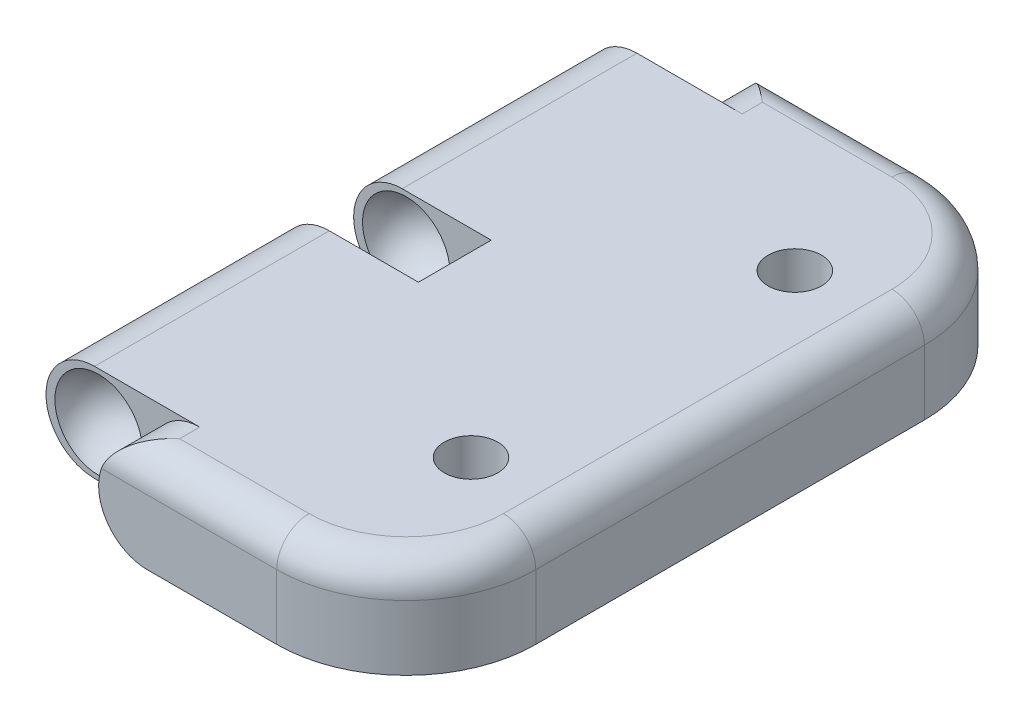
ISO-10303-21;
HEADER;
FILE_DESCRIPTION(('STEP AP214'),'2;1');
FILE_NAME('part.step','',(''),(''),'','','');
FILE_SCHEMA(('AUTOMOTIVE_DESIGN { 1 0 10303 214 1 1 1 1 }'));
ENDSEC;
DATA;
#1=APPLICATION_CONTEXT('core data for automotive mechanical design processes');
#2=APPLICATION_PROTOCOL_DEFINITION('international standard','automotive_design',2000,#1);
#3=PRODUCT_CONTEXT('',#1,'mechanical');
#4=PRODUCT('Part','Part','',(#3));
#5=PRODUCT_RELATED_PRODUCT_CATEGORY('part','',(#4));
#6=PRODUCT_DEFINITION_FORMATION('','',#4);
#7=PRODUCT_DEFINITION_CONTEXT('part definition',#1,'design');
#8=PRODUCT_DEFINITION('design','',#6,#7);
#9=PRODUCT_DEFINITION_SHAPE('','',#8);
#10=(LENGTH_UNIT() NAMED_UNIT(*) SI_UNIT(.MILLI.,.METRE.));
#11=(NAMED_UNIT(*) PLANE_ANGLE_UNIT() SI_UNIT($,.RADIAN.));
#12=(NAMED_UNIT(*) SI_UNIT($,.STERADIAN.) SOLID_ANGLE_UNIT());
#13=UNCERTAINTY_MEASURE_WITH_UNIT(LENGTH_MEASURE(1.E-05),#10,'distance_accuracy_value','');
#14=(GEOMETRIC_REPRESENTATION_CONTEXT(3) GLOBAL_UNCERTAINTY_ASSIGNED_CONTEXT((#13)) GLOBAL_UNIT_ASSIGNED_CONTEXT((#10,
#11,#12)) REPRESENTATION_CONTEXT('',''));
#15=CARTESIAN_POINT('',(0.,0.,0.));
#16=DIRECTION('',(0.,0.,1.));
#17=DIRECTION('',(1.,0.,0.));
#18=AXIS2_PLACEMENT_3D('',#15,#16,#17);
#19=CARTESIAN_POINT('',(652.958258550736,837.706805087975,1246.54216775539));
#20=DIRECTION('',(-1.,0.,0.));
#21=DIRECTION('',(0.,0.,1.));
#22=AXIS2_PLACEMENT_3D('',#19,#20,#21);
#23=PLANE('',#22);
#24=DIRECTION('',(0.,1.,0.));
#25=VECTOR('',#24,1.);
#26=CARTESIAN_POINT('',(652.958258550736,837.706805087975,1268.79216775539));
#27=LINE('',#26,#25);
#28=CARTESIAN_POINT('',(652.958258550736,881.989984738944,1268.79216775539));
#29=VERTEX_POINT('',#28);
#30=CARTESIAN_POINT('',(652.958258550736,884.989984738944,1268.79216775539));
#31=VERTEX_POINT('',#30);
#32=EDGE_CURVE('E291',#29,#31,#27,.T.);
#33=ORIENTED_EDGE('',*,*,#32,.T.);
#34=DIRECTION('',(0.,0.,-1.));
#35=VECTOR('',#34,1.);
#36=CARTESIAN_POINT('',(652.958258550736,884.989984738944,1246.54216775539));
#37=LINE('',#36,#35);
#38=CARTESIAN_POINT('',(652.958258550736,884.989984738944,1264.29216775539));
#39=VERTEX_POINT('',#38);
#40=EDGE_CURVE('E65',#31,#39,#37,.T.);
#41=ORIENTED_EDGE('',*,*,#40,.T.);
#42=DIRECTION('',(0.,1.,0.));
#43=VECTOR('',#42,1.);
#44=CARTESIAN_POINT('',(652.958258550736,887.989984738944,1264.29216775539));
#45=LINE('',#44,#43);
#46=CARTESIAN_POINT('',(652.958258550736,881.989984738944,1264.29216775539));
#47=VERTEX_POINT('',#46);
#48=EDGE_CURVE('E243',#47,#39,#45,.T.);
#49=ORIENTED_EDGE('',*,*,#48,.F.);
#50=DIRECTION('',(0.,0.,-1.));
#51=VECTOR('',#50,1.);
#52=CARTESIAN_POINT('',(652.958258550736,881.989984738944,1246.54216775539));
#53=LINE('',#52,#51);
#54=EDGE_CURVE('E250',#29,#47,#53,.T.);
#55=ORIENTED_EDGE('',*,*,#54,.F.);
#56=EDGE_LOOP('',(#33,#41,#49,#55));
#57=FACE_BOUND('',#56,.T.);
#58=ADVANCED_FACE('F50',(#57),#23,.T.);
#59=CARTESIAN_POINT('',(659.458258550736,887.989984738944,1264.29216775539));
#60=DIRECTION('',(0.,0.,-1.));
#61=DIRECTION('',(-1.,0.,0.));
#62=AXIS2_PLACEMENT_3D('',#59,#60,#61);
#63=PLANE('',#62);
#64=CARTESIAN_POINT('',(649.708258550736,884.989984738944,1264.29216775539));
#65=DIRECTION('',(0.,0.,-1.));
#66=DIRECTION('',(-1.,0.,0.));
#67=AXIS2_PLACEMENT_3D('',#64,#65,#66);
#68=CIRCLE('',#67,2.70000000000001);
#69=CARTESIAN_POINT('',(647.008258550736,884.989984738944,1264.29216775539));
#70=VERTEX_POINT('',#69);
#71=EDGE_CURVE('E267',#70,#70,#68,.T.);
#72=ORIENTED_EDGE('',*,*,#71,.T.);
#73=EDGE_LOOP('',(#72));
#74=FACE_BOUND('',#73,.T.);
#75=DIRECTION('',(1.,0.,0.));
#76=VECTOR('',#75,1.);
#77=CARTESIAN_POINT('',(659.458258550736,881.989984738944,1264.29216775539));
#78=LINE('',#77,#76);
#79=CARTESIAN_POINT('',(649.458258550736,881.989984738944,1264.29216775539));
#80=VERTEX_POINT('',#79);
#81=EDGE_CURVE('E279',#80,#47,#78,.T.);
#82=ORIENTED_EDGE('',*,*,#81,.T.);
#83=ORIENTED_EDGE('',*,*,#48,.T.);
#84=DIRECTION('',(-0.554700196225229,-0.832050294337844,0.));
#85=VECTOR('',#84,1.);
#86=CARTESIAN_POINT('',(656.342873935351,890.066907815867,1264.29216775539));
#87=LINE('',#86,#85);
#88=CARTESIAN_POINT('',(654.958258550736,887.989984738944,1264.29216775539));
#89=VERTEX_POINT('',#88);
#90=EDGE_CURVE('E11',#39,#89,#87,.F.);
#91=ORIENTED_EDGE('',*,*,#90,.T.);
#92=DIRECTION('',(1.,0.,0.));
#93=VECTOR('',#92,1.);
#94=CARTESIAN_POINT('',(659.458258550736,887.989984738944,1264.29216775539));
#95=LINE('',#94,#93);
#96=CARTESIAN_POINT('',(649.458258550736,887.989984738944,1264.29216775539));
#97=VERTEX_POINT('',#96);
#98=EDGE_CURVE('E268',#97,#89,#95,.T.);
#99=ORIENTED_EDGE('',*,*,#98,.F.);
#100=CARTESIAN_POINT('',(649.458258550736,884.989984738944,1264.29216775539));
#101=DIRECTION('',(0.,0.,-1.));
#102=DIRECTION('',(-1.,0.,0.));
#103=AXIS2_PLACEMENT_3D('',#100,#101,#102);
#104=CIRCLE('',#103,3.);
#105=CARTESIAN_POINT('',(646.458258550736,884.989984738944,1264.29216775539));
#106=VERTEX_POINT('',#105);
#107=EDGE_CURVE('E287',#97,#106,#104,.F.);
#108=ORIENTED_EDGE('',*,*,#107,.T.);
#109=CARTESIAN_POINT('',(649.458258550736,884.989984738944,1264.29216775539));
#110=DIRECTION('',(0.,0.,-1.));
#111=DIRECTION('',(-1.,0.,0.));
#112=AXIS2_PLACEMENT_3D('',#109,#110,#111);
#113=CIRCLE('',#112,3.);
#114=EDGE_CURVE('E289',#106,#80,#113,.F.);
#115=ORIENTED_EDGE('',*,*,#114,.T.);
#116=EDGE_LOOP('',(#82,#83,#91,#99,#108,#115));
#117=FACE_BOUND('',#116,.T.);
#118=ADVANCED_FACE('F425',(#74,#117),#63,.F.);
#119=CARTESIAN_POINT('',(659.458258550736,887.989984738944,1249.79216775539));
#120=DIRECTION('',(0.,0.,1.));
#121=DIRECTION('',(1.,0.,0.));
#122=AXIS2_PLACEMENT_3D('',#119,#120,#121);
#123=PLANE('',#122);
#124=CARTESIAN_POINT('',(649.708258550736,884.989984738944,1249.79216775539));
#125=DIRECTION('',(0.,0.,-1.));
#126=DIRECTION('',(-1.,0.,0.));
#127=AXIS2_PLACEMENT_3D('',#124,#125,#126);
#128=CIRCLE('',#127,2.70000000000001);
#129=CARTESIAN_POINT('',(647.008258550736,884.989984738944,1249.79216775539));
#130=VERTEX_POINT('',#129);
#131=EDGE_CURVE('E261',#130,#130,#128,.T.);
#132=ORIENTED_EDGE('',*,*,#131,.F.);
#133=EDGE_LOOP('',(#132));
#134=FACE_BOUND('',#133,.T.);
#135=DIRECTION('',(-1.,0.,0.));
#136=VECTOR('',#135,1.);
#137=CARTESIAN_POINT('',(659.458258550736,887.989984738944,1249.79216775539));
#138=LINE('',#137,#136);
#139=CARTESIAN_POINT('',(655.958258550736,887.989984738944,1249.79216775539));
#140=VERTEX_POINT('',#139);
#141=CARTESIAN_POINT('',(649.458258550736,887.989984738944,1249.79216775539));
#142=VERTEX_POINT('',#141);
#143=EDGE_CURVE('E275',#140,#142,#138,.T.);
#144=ORIENTED_EDGE('',*,*,#143,.F.);
#145=CARTESIAN_POINT('',(655.958258550736,884.989984738944,1249.79216775539));
#146=DIRECTION('',(0.,0.,1.));
#147=DIRECTION('',(1.,0.,0.));
#148=AXIS2_PLACEMENT_3D('',#145,#146,#147);
#149=CIRCLE('',#148,3.);
#150=CARTESIAN_POINT('',(652.958258550736,884.989984738944,1249.79216775539));
#151=VERTEX_POINT('',#150);
#152=EDGE_CURVE('E318',#140,#151,#149,.T.);
#153=ORIENTED_EDGE('',*,*,#152,.T.);
#154=CARTESIAN_POINT('',(655.958258550736,884.989984738944,1249.79216775539));
#155=DIRECTION('',(0.,0.,1.));
#156=DIRECTION('',(1.,0.,0.));
#157=AXIS2_PLACEMENT_3D('',#154,#155,#156);
#158=CIRCLE('',#157,3.);
#159=CARTESIAN_POINT('',(655.958258550736,881.989984738944,1249.79216775539));
#160=VERTEX_POINT('',#159);
#161=EDGE_CURVE('E320',#151,#160,#158,.T.);
#162=ORIENTED_EDGE('',*,*,#161,.T.);
#163=DIRECTION('',(-1.,0.,0.));
#164=VECTOR('',#163,1.);
#165=CARTESIAN_POINT('',(659.458258550736,881.989984738944,1249.79216775539));
#166=LINE('',#165,#164);
#167=CARTESIAN_POINT('',(649.458258550736,881.989984738944,1249.79216775539));
#168=VERTEX_POINT('',#167);
#169=EDGE_CURVE('E271',#160,#168,#166,.T.);
#170=ORIENTED_EDGE('',*,*,#169,.T.);
#171=CARTESIAN_POINT('',(649.458258550736,884.989984738944,1249.79216775539));
#172=DIRECTION('',(0.,0.,1.));
#173=DIRECTION('',(1.,0.,0.));
#174=AXIS2_PLACEMENT_3D('',#171,#172,#173);
#175=CIRCLE('',#174,3.);
#176=CARTESIAN_POINT('',(646.458258550736,884.989984738944,1249.79216775539));
#177=VERTEX_POINT('',#176);
#178=EDGE_CURVE('E282',#168,#177,#175,.F.);
#179=ORIENTED_EDGE('',*,*,#178,.T.);
#180=CARTESIAN_POINT('',(649.458258550736,884.989984738944,1249.79216775539));
#181=DIRECTION('',(0.,0.,1.));
#182=DIRECTION('',(1.,0.,0.));
#183=AXIS2_PLACEMENT_3D('',#180,#181,#182);
#184=CIRCLE('',#183,3.);
#185=EDGE_CURVE('E283',#177,#142,#184,.F.);
#186=ORIENTED_EDGE('',*,*,#185,.T.);
#187=EDGE_LOOP('',(#144,#153,#162,#170,#179,#186));
#188=FACE_BOUND('',#187,.T.);
#189=ADVANCED_FACE('F429',(#134,#188),#123,.F.);
#190=CARTESIAN_POINT('',(652.958258550736,887.989984738944,1257.04216775539));
#191=DIRECTION('',(0.,1.,0.));
#192=DIRECTION('',(0.,0.,1.));
#193=AXIS2_PLACEMENT_3D('',#190,#191,#192);
#194=PLANE('',#193);
#195=DIRECTION('',(0.,0.,1.));
#196=VECTOR('',#195,1.);
#197=CARTESIAN_POINT('',(654.958258550736,887.989984738944,1257.04216775539));
#198=LINE('',#197,#196);
#199=CARTESIAN_POINT('',(654.958258550736,887.989984738944,1268.79216775539));
#200=VERTEX_POINT('',#199);
#201=EDGE_CURVE('E474',#89,#200,#198,.T.);
#202=ORIENTED_EDGE('',*,*,#201,.T.);
#203=DIRECTION('',(-1.,0.,0.));
#204=VECTOR('',#203,1.);
#205=CARTESIAN_POINT('',(659.458258550736,887.989984738944,1268.79216775539));
#206=LINE('',#205,#204);
#207=CARTESIAN_POINT('',(649.458258550736,887.989984738944,1268.79216775539));
#208=VERTEX_POINT('',#207);
#209=EDGE_CURVE('E203',#200,#208,#206,.T.);
#210=ORIENTED_EDGE('',*,*,#209,.T.);
#211=DIRECTION('',(0.,0.,1.));
#212=VECTOR('',#211,1.);
#213=CARTESIAN_POINT('',(649.458258550736,887.989984738944,1283.29216775539));
#214=LINE('',#213,#212);
#215=CARTESIAN_POINT('',(649.458258550736,887.989984738944,1283.29216775539));
#216=VERTEX_POINT('',#215);
#217=EDGE_CURVE('E200',#208,#216,#214,.T.);
#218=ORIENTED_EDGE('',*,*,#217,.T.);
#219=DIRECTION('',(1.,0.,0.));
#220=VECTOR('',#219,1.);
#221=CARTESIAN_POINT('',(659.458258550736,887.989984738944,1283.29216775539));
#222=LINE('',#221,#220);
#223=CARTESIAN_POINT('',(655.958258550736,887.989984738944,1283.29216775539));
#224=VERTEX_POINT('',#223);
#225=EDGE_CURVE('E204',#216,#224,#222,.T.);
#226=ORIENTED_EDGE('',*,*,#225,.T.);
#227=DIRECTION('',(0.,0.,1.));
#228=VECTOR('',#227,1.);
#229=CARTESIAN_POINT('',(655.958258550736,887.989984738944,1257.04216775539));
#230=LINE('',#229,#228);
#231=CARTESIAN_POINT('',(655.958258550736,887.989984738944,1284.54216775539));
#232=VERTEX_POINT('',#231);
#233=EDGE_CURVE('E308',#224,#232,#230,.T.);
#234=ORIENTED_EDGE('',*,*,#233,.T.);
#235=DIRECTION('',(1.,0.,0.));
#236=VECTOR('',#235,1.);
#237=CARTESIAN_POINT('',(652.958258550736,887.989984738944,1284.54216775539));
#238=LINE('',#237,#236);
#239=CARTESIAN_POINT('',(663.958258550736,887.989984738944,1284.54216775539));
#240=VERTEX_POINT('',#239);
#241=EDGE_CURVE('E352',#232,#240,#238,.T.);
#242=ORIENTED_EDGE('',*,*,#241,.T.);
#243=CARTESIAN_POINT('',(663.958258550736,887.989984738944,1278.54216775539));
#244=DIRECTION('',(0.,1.,0.));
#245=DIRECTION('',(0.,0.,1.));
#246=AXIS2_PLACEMENT_3D('',#243,#244,#245);
#247=CIRCLE('',#246,6.);
#248=CARTESIAN_POINT('',(669.958258550736,887.989984738944,1278.54216775539));
#249=VERTEX_POINT('',#248);
#250=EDGE_CURVE('E347',#240,#249,#247,.T.);
#251=ORIENTED_EDGE('',*,*,#250,.T.);
#252=DIRECTION('',(0.,0.,-1.));
#253=VECTOR('',#252,1.);
#254=CARTESIAN_POINT('',(669.958258550736,887.989984738944,1257.04216775539));
#255=LINE('',#254,#253);
#256=CARTESIAN_POINT('',(669.958258550736,887.989984738944,1254.54216775539));
#257=VERTEX_POINT('',#256);
#258=EDGE_CURVE('E350',#249,#257,#255,.T.);
#259=ORIENTED_EDGE('',*,*,#258,.T.);
#260=CARTESIAN_POINT('',(663.958258550736,887.989984738944,1254.54216775539));
#261=DIRECTION('',(0.,1.,0.));
#262=DIRECTION('',(0.,0.,1.));
#263=AXIS2_PLACEMENT_3D('',#260,#261,#262);
#264=CIRCLE('',#263,6.);
#265=CARTESIAN_POINT('',(663.958258550736,887.989984738944,1248.54216775539));
#266=VERTEX_POINT('',#265);
#267=EDGE_CURVE('E354',#257,#266,#264,.T.);
#268=ORIENTED_EDGE('',*,*,#267,.T.);
#269=DIRECTION('',(-1.,0.,0.));
#270=VECTOR('',#269,1.);
#271=CARTESIAN_POINT('',(652.958258550736,887.989984738944,1248.54216775539));
#272=LINE('',#271,#270);
#273=CARTESIAN_POINT('',(655.958258550736,887.989984738944,1248.54216775539));
#274=VERTEX_POINT('',#273);
#275=EDGE_CURVE('E353',#266,#274,#272,.T.);
#276=ORIENTED_EDGE('',*,*,#275,.T.);
#277=DIRECTION('',(0.,0.,1.));
#278=VECTOR('',#277,1.);
#279=CARTESIAN_POINT('',(655.958258550736,887.989984738944,1257.04216775539));
#280=LINE('',#279,#278);
#281=EDGE_CURVE('E309',#274,#140,#280,.T.);
#282=ORIENTED_EDGE('',*,*,#281,.T.);
#283=ORIENTED_EDGE('',*,*,#143,.T.);
#284=DIRECTION('',(0.,0.,1.));
#285=VECTOR('',#284,1.);
#286=CARTESIAN_POINT('',(649.458258550736,887.989984738944,1264.29216775539));
#287=LINE('',#286,#285);
#288=EDGE_CURVE('E273',#142,#97,#287,.T.);
#289=ORIENTED_EDGE('',*,*,#288,.T.);
#290=ORIENTED_EDGE('',*,*,#98,.T.);
#291=EDGE_LOOP('',(#202,#210,#218,#226,#234,#242,#251,#259,#268,#276,#282,#283,#289,#290));
#292=FACE_BOUND('',#291,.T.);
#293=CARTESIAN_POINT('',(665.958258550736,887.989984738944,1256.54216775539));
#294=DIRECTION('',(0.,1.,0.));
#295=DIRECTION('',(0.,0.,1.));
#296=AXIS2_PLACEMENT_3D('',#293,#294,#295);
#297=CIRCLE('',#296,1.65000000000005);
#298=CARTESIAN_POINT('',(665.958258550736,887.989984738944,1258.19216775539));
#299=VERTEX_POINT('',#298);
#300=EDGE_CURVE('E255',#299,#299,#297,.T.);
#301=ORIENTED_EDGE('',*,*,#300,.F.);
#302=EDGE_LOOP('',(#301));
#303=FACE_BOUND('',#302,.T.);
#304=CARTESIAN_POINT('',(665.958258550736,887.989984738944,1276.54216775539));
#305=DIRECTION('',(0.,1.,0.));
#306=DIRECTION('',(0.,0.,1.));
#307=AXIS2_PLACEMENT_3D('',#304,#305,#306);
#308=CIRCLE('',#307,1.65000000000005);
#309=CARTESIAN_POINT('',(665.958258550736,887.989984738944,1278.19216775539));
#310=VERTEX_POINT('',#309);
#311=EDGE_CURVE('E236',#310,#310,#308,.T.);
#312=ORIENTED_EDGE('',*,*,#311,.F.);
#313=EDGE_LOOP('',(#312));
#314=FACE_BOUND('',#313,.T.);
#315=ADVANCED_FACE('F199',(#292,#303,#314),#194,.T.);
#316=CARTESIAN_POINT('',(652.958258550736,881.989984738944,1257.04216775539));
#317=DIRECTION('',(0.,1.,0.));
#318=DIRECTION('',(0.,0.,1.));
#319=AXIS2_PLACEMENT_3D('',#316,#317,#318);
#320=PLANE('',#319);
#321=DIRECTION('',(0.,0.,1.));
#322=VECTOR('',#321,1.);
#323=CARTESIAN_POINT('',(671.958258550736,881.989984738944,1246.54216775539));
#324=LINE('',#323,#322);
#325=CARTESIAN_POINT('',(671.958258550736,881.989984738944,1254.54216775539));
#326=VERTEX_POINT('',#325);
#327=CARTESIAN_POINT('',(671.958258550736,881.989984738944,1278.54216775539));
#328=VERTEX_POINT('',#327);
#329=EDGE_CURVE('E247',#326,#328,#324,.T.);
#330=ORIENTED_EDGE('',*,*,#329,.T.);
#331=CARTESIAN_POINT('',(663.958258550736,881.989984738944,1278.54216775539));
#332=DIRECTION('',(0.,1.,0.));
#333=DIRECTION('',(0.,0.,1.));
#334=AXIS2_PLACEMENT_3D('',#331,#332,#333);
#335=CIRCLE('',#334,8.);
#336=CARTESIAN_POINT('',(663.958258550736,881.989984738944,1286.54216775539));
#337=VERTEX_POINT('',#336);
#338=EDGE_CURVE('E345',#328,#337,#335,.F.);
#339=ORIENTED_EDGE('',*,*,#338,.T.);
#340=DIRECTION('',(-1.,0.,0.));
#341=VECTOR('',#340,1.);
#342=CARTESIAN_POINT('',(652.958258550736,881.989984738944,1286.54216775539));
#343=LINE('',#342,#341);
#344=CARTESIAN_POINT('',(655.958258550736,881.989984738944,1286.54216775539));
#345=VERTEX_POINT('',#344);
#346=EDGE_CURVE('E244',#337,#345,#343,.T.);
#347=ORIENTED_EDGE('',*,*,#346,.T.);
#348=DIRECTION('',(0.,0.,-1.));
#349=VECTOR('',#348,1.);
#350=CARTESIAN_POINT('',(655.958258550736,881.989984738944,1283.29216775539));
#351=LINE('',#350,#349);
#352=CARTESIAN_POINT('',(655.958258550736,881.989984738944,1283.29216775539));
#353=VERTEX_POINT('',#352);
#354=EDGE_CURVE('E300',#345,#353,#351,.T.);
#355=ORIENTED_EDGE('',*,*,#354,.T.);
#356=DIRECTION('',(1.,0.,0.));
#357=VECTOR('',#356,1.);
#358=CARTESIAN_POINT('',(659.458258550736,881.989984738944,1283.29216775539));
#359=LINE('',#358,#357);
#360=CARTESIAN_POINT('',(649.458258550736,881.989984738944,1283.29216775539));
#361=VERTEX_POINT('',#360);
#362=EDGE_CURVE('E238',#361,#353,#359,.T.);
#363=ORIENTED_EDGE('',*,*,#362,.F.);
#364=DIRECTION('',(0.,0.,1.));
#365=VECTOR('',#364,1.);
#366=CARTESIAN_POINT('',(649.458258550736,881.989984738944,1276.04216775539));
#367=LINE('',#366,#365);
#368=CARTESIAN_POINT('',(649.458258550736,881.989984738944,1268.79216775539));
#369=VERTEX_POINT('',#368);
#370=EDGE_CURVE('E230',#361,#369,#367,.F.);
#371=ORIENTED_EDGE('',*,*,#370,.T.);
#372=DIRECTION('',(-1.,0.,0.));
#373=VECTOR('',#372,1.);
#374=CARTESIAN_POINT('',(659.458258550736,881.989984738944,1268.79216775539));
#375=LINE('',#374,#373);
#376=EDGE_CURVE('E219',#29,#369,#375,.T.);
#377=ORIENTED_EDGE('',*,*,#376,.F.);
#378=ORIENTED_EDGE('',*,*,#54,.T.);
#379=ORIENTED_EDGE('',*,*,#81,.F.);
#380=DIRECTION('',(0.,0.,1.));
#381=VECTOR('',#380,1.);
#382=CARTESIAN_POINT('',(649.458258550736,881.989984738944,1257.04216775539));
#383=LINE('',#382,#381);
#384=EDGE_CURVE('E288',#80,#168,#383,.F.);
#385=ORIENTED_EDGE('',*,*,#384,.T.);
#386=ORIENTED_EDGE('',*,*,#169,.F.);
#387=DIRECTION('',(0.,0.,-1.));
#388=VECTOR('',#387,1.);
#389=CARTESIAN_POINT('',(655.958258550736,881.989984738944,1246.54216775539));
#390=LINE('',#389,#388);
#391=CARTESIAN_POINT('',(655.958258550736,881.989984738944,1246.54216775539));
#392=VERTEX_POINT('',#391);
#393=EDGE_CURVE('E297',#160,#392,#390,.T.);
#394=ORIENTED_EDGE('',*,*,#393,.T.);
#395=DIRECTION('',(1.,0.,0.));
#396=VECTOR('',#395,1.);
#397=CARTESIAN_POINT('',(652.958258550736,881.989984738944,1246.54216775539));
#398=LINE('',#397,#396);
#399=CARTESIAN_POINT('',(663.958258550736,881.989984738944,1246.54216775539));
#400=VERTEX_POINT('',#399);
#401=EDGE_CURVE('E252',#392,#400,#398,.T.);
#402=ORIENTED_EDGE('',*,*,#401,.T.);
#403=CARTESIAN_POINT('',(663.958258550736,881.989984738944,1254.54216775539));
#404=DIRECTION('',(0.,1.,0.));
#405=DIRECTION('',(0.,0.,1.));
#406=AXIS2_PLACEMENT_3D('',#403,#404,#405);
#407=CIRCLE('',#406,8.);
#408=EDGE_CURVE('E344',#400,#326,#407,.F.);
#409=ORIENTED_EDGE('',*,*,#408,.T.);
#410=EDGE_LOOP('',(#330,#339,#347,#355,#363,#371,#377,#378,#379,#385,#386,#394,#402,#409));
#411=FACE_BOUND('',#410,.T.);
#412=CARTESIAN_POINT('',(665.958258550736,881.989984738944,1256.54216775539));
#413=DIRECTION('',(0.,1.,0.));
#414=DIRECTION('',(0.,0.,1.));
#415=AXIS2_PLACEMENT_3D('',#412,#413,#414);
#416=CIRCLE('',#415,1.65000000000005);
#417=CARTESIAN_POINT('',(665.958258550736,881.989984738944,1258.19216775539));
#418=VERTEX_POINT('',#417);
#419=EDGE_CURVE('E239',#418,#418,#416,.F.);
#420=ORIENTED_EDGE('',*,*,#419,.F.);
#421=EDGE_LOOP('',(#420));
#422=FACE_BOUND('',#421,.T.);
#423=CARTESIAN_POINT('',(665.958258550736,881.989984738944,1276.54216775539));
#424=DIRECTION('',(0.,1.,0.));
#425=DIRECTION('',(0.,0.,1.));
#426=AXIS2_PLACEMENT_3D('',#423,#424,#425);
#427=CIRCLE('',#426,1.65000000000005);
#428=CARTESIAN_POINT('',(665.958258550736,881.989984738944,1278.19216775539));
#429=VERTEX_POINT('',#428);
#430=EDGE_CURVE('E242',#429,#429,#427,.F.);
#431=ORIENTED_EDGE('',*,*,#430,.F.);
#432=EDGE_LOOP('',(#431));
#433=FACE_BOUND('',#432,.T.);
#434=ADVANCED_FACE('F450',(#411,#422,#433),#320,.F.);
#435=CARTESIAN_POINT('',(649.458258550736,884.989984738944,1257.04216775539));
#436=DIRECTION('',(0.,0.,-1.));
#437=DIRECTION('',(-1.,0.,0.));
#438=AXIS2_PLACEMENT_3D('',#435,#436,#437);
#439=CYLINDRICAL_SURFACE('',#438,3.);
#440=ORIENTED_EDGE('',*,*,#288,.F.);
#441=ORIENTED_EDGE('',*,*,#185,.F.);
#442=DIRECTION('',(0.,0.,1.));
#443=VECTOR('',#442,1.);
#444=CARTESIAN_POINT('',(646.458258550736,884.989984738944,1249.79216775539));
#445=LINE('',#444,#443);
#446=EDGE_CURVE('E266',#106,#177,#445,.F.);
#447=ORIENTED_EDGE('',*,*,#446,.F.);
#448=ORIENTED_EDGE('',*,*,#107,.F.);
#449=EDGE_LOOP('',(#440,#441,#447,#448));
#450=FACE_BOUND('',#449,.T.);
#451=ADVANCED_FACE('F448',(#450),#439,.T.);
#452=CARTESIAN_POINT('',(649.458258550736,884.989984738944,1264.29216775539));
#453=DIRECTION('',(0.,0.,1.));
#454=DIRECTION('',(1.,0.,0.));
#455=AXIS2_PLACEMENT_3D('',#452,#453,#454);
#456=CYLINDRICAL_SURFACE('',#455,3.);
#457=ORIENTED_EDGE('',*,*,#178,.F.);
#458=ORIENTED_EDGE('',*,*,#384,.F.);
#459=ORIENTED_EDGE('',*,*,#114,.F.);
#460=ORIENTED_EDGE('',*,*,#446,.T.);
#461=EDGE_LOOP('',(#457,#458,#459,#460));
#462=FACE_BOUND('',#461,.T.);
#463=ADVANCED_FACE('F442',(#462),#456,.T.);
#464=CARTESIAN_POINT('',(649.708258550736,884.989984738944,1264.29216775539));
#465=DIRECTION('',(0.,0.,1.));
#466=DIRECTION('',(0.,-1.,0.));
#467=AXIS2_PLACEMENT_3D('',#464,#465,#466);
#468=SPHERICAL_SURFACE('',#467,2.7);
#469=ORIENTED_EDGE('',*,*,#71,.F.);
#470=EDGE_LOOP('',(#469));
#471=FACE_BOUND('',#470,.T.);
#472=ADVANCED_FACE('F437',(#471),#468,.F.);
#473=CARTESIAN_POINT('',(649.708258550736,884.989984738944,1249.79216775539));
#474=DIRECTION('',(0.,0.,-1.));
#475=DIRECTION('',(0.,-1.,0.));
#476=AXIS2_PLACEMENT_3D('',#473,#474,#475);
#477=SPHERICAL_SURFACE('',#476,2.7);
#478=ORIENTED_EDGE('',*,*,#131,.T.);
#479=EDGE_LOOP('',(#478));
#480=FACE_BOUND('',#479,.T.);
#481=ADVANCED_FACE('F436',(#480),#477,.F.);
#482=CARTESIAN_POINT('',(652.958258550736,837.706805087975,1286.54216775539));
#483=DIRECTION('',(0.,0.,1.));
#484=DIRECTION('',(1.,0.,0.));
#485=AXIS2_PLACEMENT_3D('',#482,#483,#484);
#486=PLANE('',#485);
#487=DIRECTION('',(0.,1.,0.));
#488=VECTOR('',#487,1.);
#489=CARTESIAN_POINT('',(663.958258550736,837.706805087975,1286.54216775539));
#490=LINE('',#489,#488);
#491=CARTESIAN_POINT('',(663.958258550736,885.989984738944,1286.54216775539));
#492=VERTEX_POINT('',#491);
#493=EDGE_CURVE('E322',#337,#492,#490,.T.);
#494=ORIENTED_EDGE('',*,*,#493,.T.);
#495=DIRECTION('',(1.,0.,0.));
#496=VECTOR('',#495,1.);
#497=CARTESIAN_POINT('',(652.958258550736,885.989984738944,1286.54216775539));
#498=LINE('',#497,#496);
#499=CARTESIAN_POINT('',(653.12983142599,885.989984738944,1286.54216775539));
#500=VERTEX_POINT('',#499);
#501=EDGE_CURVE('E398',#492,#500,#498,.F.);
#502=ORIENTED_EDGE('',*,*,#501,.T.);
#503=CARTESIAN_POINT('',(655.958258550736,884.989984738944,1286.54216775539));
#504=DIRECTION('',(0.,0.,1.));
#505=DIRECTION('',(1.,0.,0.));
#506=AXIS2_PLACEMENT_3D('',#503,#504,#505);
#507=CIRCLE('',#506,3.);
#508=CARTESIAN_POINT('',(652.958258550736,884.989984738944,1286.54216775539));
#509=VERTEX_POINT('',#508);
#510=EDGE_CURVE('E315',#500,#509,#507,.T.);
#511=ORIENTED_EDGE('',*,*,#510,.T.);
#512=CARTESIAN_POINT('',(655.958258550736,884.989984738944,1286.54216775539));
#513=DIRECTION('',(0.,0.,1.));
#514=DIRECTION('',(1.,0.,0.));
#515=AXIS2_PLACEMENT_3D('',#512,#513,#514);
#516=CIRCLE('',#515,3.);
#517=EDGE_CURVE('E313',#509,#345,#516,.T.);
#518=ORIENTED_EDGE('',*,*,#517,.T.);
#519=ORIENTED_EDGE('',*,*,#346,.F.);
#520=EDGE_LOOP('',(#494,#502,#511,#518,#519));
#521=FACE_BOUND('',#520,.T.);
#522=ADVANCED_FACE('F432',(#521),#486,.T.);
#523=CARTESIAN_POINT('',(671.958258550736,837.706805087975,1246.54216775539));
#524=DIRECTION('',(1.,0.,0.));
#525=DIRECTION('',(0.,0.,-1.));
#526=AXIS2_PLACEMENT_3D('',#523,#524,#525);
#527=PLANE('',#526);
#528=DIRECTION('',(0.,1.,0.));
#529=VECTOR('',#528,1.);
#530=CARTESIAN_POINT('',(671.958258550736,837.706805087975,1254.54216775539));
#531=LINE('',#530,#529);
#532=CARTESIAN_POINT('',(671.958258550736,885.989984738944,1254.54216775539));
#533=VERTEX_POINT('',#532);
#534=EDGE_CURVE('E337',#326,#533,#531,.T.);
#535=ORIENTED_EDGE('',*,*,#534,.T.);
#536=DIRECTION('',(0.,0.,-1.));
#537=VECTOR('',#536,1.);
#538=CARTESIAN_POINT('',(671.958258550736,885.989984738944,1246.54216775539));
#539=LINE('',#538,#537);
#540=CARTESIAN_POINT('',(671.958258550736,885.989984738944,1278.54216775539));
#541=VERTEX_POINT('',#540);
#542=EDGE_CURVE('E471',#533,#541,#539,.F.);
#543=ORIENTED_EDGE('',*,*,#542,.T.);
#544=DIRECTION('',(0.,1.,0.));
#545=VECTOR('',#544,1.);
#546=CARTESIAN_POINT('',(671.958258550736,837.706805087975,1278.54216775539));
#547=LINE('',#546,#545);
#548=EDGE_CURVE('E339',#541,#328,#547,.F.);
#549=ORIENTED_EDGE('',*,*,#548,.T.);
#550=ORIENTED_EDGE('',*,*,#329,.F.);
#551=EDGE_LOOP('',(#535,#543,#549,#550));
#552=FACE_BOUND('',#551,.T.);
#553=ADVANCED_FACE('F502',(#552),#527,.T.);
#554=CARTESIAN_POINT('',(652.958258550736,837.706805087975,1246.54216775539));
#555=DIRECTION('',(0.,0.,-1.));
#556=DIRECTION('',(-1.,0.,0.));
#557=AXIS2_PLACEMENT_3D('',#554,#555,#556);
#558=PLANE('',#557);
#559=CARTESIAN_POINT('',(655.958258550736,884.989984738944,1246.54216775539));
#560=DIRECTION('',(0.,0.,-1.));
#561=DIRECTION('',(-1.,0.,0.));
#562=AXIS2_PLACEMENT_3D('',#559,#560,#561);
#563=CIRCLE('',#562,3.);
#564=CARTESIAN_POINT('',(652.958258550736,884.989984738944,1246.54216775539));
#565=VERTEX_POINT('',#564);
#566=CARTESIAN_POINT('',(653.12983142599,885.989984738944,1246.54216775539));
#567=VERTEX_POINT('',#566);
#568=EDGE_CURVE('E303',#565,#567,#563,.T.);
#569=ORIENTED_EDGE('',*,*,#568,.T.);
#570=DIRECTION('',(-1.,0.,0.));
#571=VECTOR('',#570,1.);
#572=CARTESIAN_POINT('',(652.958258550736,885.989984738944,1246.54216775539));
#573=LINE('',#572,#571);
#574=CARTESIAN_POINT('',(663.958258550736,885.989984738944,1246.54216775539));
#575=VERTEX_POINT('',#574);
#576=EDGE_CURVE('E366',#567,#575,#573,.F.);
#577=ORIENTED_EDGE('',*,*,#576,.T.);
#578=DIRECTION('',(0.,1.,0.));
#579=VECTOR('',#578,1.);
#580=CARTESIAN_POINT('',(663.958258550736,837.706805087975,1246.54216775539));
#581=LINE('',#580,#579);
#582=EDGE_CURVE('E342',#575,#400,#581,.F.);
#583=ORIENTED_EDGE('',*,*,#582,.T.);
#584=ORIENTED_EDGE('',*,*,#401,.F.);
#585=CARTESIAN_POINT('',(655.958258550736,884.989984738944,1246.54216775539));
#586=DIRECTION('',(0.,0.,-1.));
#587=DIRECTION('',(-1.,0.,0.));
#588=AXIS2_PLACEMENT_3D('',#585,#586,#587);
#589=CIRCLE('',#588,3.);
#590=EDGE_CURVE('E306',#392,#565,#589,.T.);
#591=ORIENTED_EDGE('',*,*,#590,.T.);
#592=EDGE_LOOP('',(#569,#577,#583,#584,#591));
#593=FACE_BOUND('',#592,.T.);
#594=ADVANCED_FACE('F496',(#593),#558,.T.);
#595=CARTESIAN_POINT('',(665.958258550736,837.706805087975,1256.54216775539));
#596=DIRECTION('',(0.,1.,0.));
#597=DIRECTION('',(0.,0.,1.));
#598=AXIS2_PLACEMENT_3D('',#595,#596,#597);
#599=CYLINDRICAL_SURFACE('',#598,1.65000000000005);
#600=ORIENTED_EDGE('',*,*,#419,.T.);
#601=EDGE_LOOP('',(#600));
#602=FACE_BOUND('',#601,.T.);
#603=ORIENTED_EDGE('',*,*,#300,.T.);
#604=EDGE_LOOP('',(#603));
#605=FACE_BOUND('',#604,.T.);
#606=ADVANCED_FACE('F556',(#602,#605),#599,.F.);
#607=CARTESIAN_POINT('',(665.958258550736,837.706805087975,1276.54216775539));
#608=DIRECTION('',(0.,1.,0.));
#609=DIRECTION('',(0.,0.,1.));
#610=AXIS2_PLACEMENT_3D('',#607,#608,#609);
#611=CYLINDRICAL_SURFACE('',#610,1.65000000000005);
#612=ORIENTED_EDGE('',*,*,#430,.T.);
#613=EDGE_LOOP('',(#612));
#614=FACE_BOUND('',#613,.T.);
#615=ORIENTED_EDGE('',*,*,#311,.T.);
#616=EDGE_LOOP('',(#615));
#617=FACE_BOUND('',#616,.T.);
#618=ADVANCED_FACE('F549',(#614,#617),#611,.F.);
#619=CARTESIAN_POINT('',(659.458258550736,887.989984738944,1283.29216775539));
#620=DIRECTION('',(0.,0.,-1.));
#621=DIRECTION('',(-1.,0.,0.));
#622=AXIS2_PLACEMENT_3D('',#619,#620,#621);
#623=PLANE('',#622);
#624=CARTESIAN_POINT('',(655.958258550736,884.989984738944,1283.29216775539));
#625=DIRECTION('',(0.,0.,-1.));
#626=DIRECTION('',(-1.,0.,0.));
#627=AXIS2_PLACEMENT_3D('',#624,#625,#626);
#628=CIRCLE('',#627,3.);
#629=CARTESIAN_POINT('',(652.958258550736,884.989984738944,1283.29216775539));
#630=VERTEX_POINT('',#629);
#631=EDGE_CURVE('E321',#353,#630,#628,.T.);
#632=ORIENTED_EDGE('',*,*,#631,.T.);
#633=CARTESIAN_POINT('',(655.958258550736,884.989984738944,1283.29216775539));
#634=DIRECTION('',(0.,0.,-1.));
#635=DIRECTION('',(-1.,0.,0.));
#636=AXIS2_PLACEMENT_3D('',#633,#634,#635);
#637=CIRCLE('',#636,3.);
#638=EDGE_CURVE('E216',#630,#224,#637,.T.);
#639=ORIENTED_EDGE('',*,*,#638,.T.);
#640=ORIENTED_EDGE('',*,*,#225,.F.);
#641=CARTESIAN_POINT('',(649.458258550736,884.989984738944,1283.29216775539));
#642=DIRECTION('',(0.,0.,-1.));
#643=DIRECTION('',(-1.,0.,0.));
#644=AXIS2_PLACEMENT_3D('',#641,#642,#643);
#645=CIRCLE('',#644,3.);
#646=CARTESIAN_POINT('',(646.458258550736,884.989984738944,1283.29216775539));
#647=VERTEX_POINT('',#646);
#648=EDGE_CURVE('E212',#216,#647,#645,.F.);
#649=ORIENTED_EDGE('',*,*,#648,.T.);
#650=CARTESIAN_POINT('',(649.458258550736,884.989984738944,1283.29216775539));
#651=DIRECTION('',(0.,0.,-1.));
#652=DIRECTION('',(-1.,0.,0.));
#653=AXIS2_PLACEMENT_3D('',#650,#651,#652);
#654=CIRCLE('',#653,3.);
#655=EDGE_CURVE('E228',#647,#361,#654,.F.);
#656=ORIENTED_EDGE('',*,*,#655,.T.);
#657=ORIENTED_EDGE('',*,*,#362,.T.);
#658=EDGE_LOOP('',(#632,#639,#640,#649,#656,#657));
#659=FACE_BOUND('',#658,.T.);
#660=CARTESIAN_POINT('',(649.708258550736,884.989984738944,1283.29216775539));
#661=DIRECTION('',(0.,0.,-1.));
#662=DIRECTION('',(-1.,0.,0.));
#663=AXIS2_PLACEMENT_3D('',#660,#661,#662);
#664=CIRCLE('',#663,2.70000000000001);
#665=CARTESIAN_POINT('',(647.008258550736,884.989984738944,1283.29216775539));
#666=VERTEX_POINT('',#665);
#667=EDGE_CURVE('E237',#666,#666,#664,.T.);
#668=ORIENTED_EDGE('',*,*,#667,.T.);
#669=EDGE_LOOP('',(#668));
#670=FACE_BOUND('',#669,.T.);
#671=ADVANCED_FACE('F215',(#659,#670),#623,.F.);
#672=CARTESIAN_POINT('',(659.458258550736,887.989984738944,1268.79216775539));
#673=DIRECTION('',(0.,0.,1.));
#674=DIRECTION('',(1.,0.,0.));
#675=AXIS2_PLACEMENT_3D('',#672,#673,#674);
#676=PLANE('',#675);
#677=ORIENTED_EDGE('',*,*,#32,.F.);
#678=ORIENTED_EDGE('',*,*,#376,.T.);
#679=CARTESIAN_POINT('',(649.458258550736,884.989984738944,1268.79216775539));
#680=DIRECTION('',(0.,0.,1.));
#681=DIRECTION('',(1.,0.,0.));
#682=AXIS2_PLACEMENT_3D('',#679,#680,#681);
#683=CIRCLE('',#682,3.);
#684=CARTESIAN_POINT('',(646.458258550736,884.989984738944,1268.79216775539));
#685=VERTEX_POINT('',#684);
#686=EDGE_CURVE('E227',#369,#685,#683,.F.);
#687=ORIENTED_EDGE('',*,*,#686,.T.);
#688=CARTESIAN_POINT('',(649.458258550736,884.989984738944,1268.79216775539));
#689=DIRECTION('',(0.,0.,1.));
#690=DIRECTION('',(1.,0.,0.));
#691=AXIS2_PLACEMENT_3D('',#688,#689,#690);
#692=CIRCLE('',#691,3.);
#693=EDGE_CURVE('E208',#685,#208,#692,.F.);
#694=ORIENTED_EDGE('',*,*,#693,.T.);
#695=ORIENTED_EDGE('',*,*,#209,.F.);
#696=DIRECTION('',(0.554700196225229,0.832050294337844,0.));
#697=VECTOR('',#696,1.);
#698=CARTESIAN_POINT('',(656.342873935351,890.066907815867,1268.79216775539));
#699=LINE('',#698,#697);
#700=EDGE_CURVE('E57',#200,#31,#699,.F.);
#701=ORIENTED_EDGE('',*,*,#700,.T.);
#702=EDGE_LOOP('',(#677,#678,#687,#694,#695,#701));
#703=FACE_BOUND('',#702,.T.);
#704=CARTESIAN_POINT('',(649.708258550736,884.989984738944,1268.79216775539));
#705=DIRECTION('',(0.,0.,-1.));
#706=DIRECTION('',(-1.,0.,0.));
#707=AXIS2_PLACEMENT_3D('',#704,#705,#706);
#708=CIRCLE('',#707,2.70000000000001);
#709=CARTESIAN_POINT('',(647.008258550736,884.989984738944,1268.79216775539));
#710=VERTEX_POINT('',#709);
#711=EDGE_CURVE('E327',#710,#710,#708,.T.);
#712=ORIENTED_EDGE('',*,*,#711,.F.);
#713=EDGE_LOOP('',(#712));
#714=FACE_BOUND('',#713,.T.);
#715=ADVANCED_FACE('F528',(#703,#714),#676,.F.);
#716=CARTESIAN_POINT('',(649.458258550736,884.989984738944,1276.04216775539));
#717=DIRECTION('',(0.,0.,-1.));
#718=DIRECTION('',(-1.,0.,0.));
#719=AXIS2_PLACEMENT_3D('',#716,#717,#718);
#720=CYLINDRICAL_SURFACE('',#719,3.);
#721=ORIENTED_EDGE('',*,*,#217,.F.);
#722=ORIENTED_EDGE('',*,*,#693,.F.);
#723=DIRECTION('',(0.,0.,1.));
#724=VECTOR('',#723,1.);
#725=CARTESIAN_POINT('',(646.458258550736,884.989984738944,1268.79216775539));
#726=LINE('',#725,#724);
#727=EDGE_CURVE('E221',#647,#685,#726,.F.);
#728=ORIENTED_EDGE('',*,*,#727,.F.);
#729=ORIENTED_EDGE('',*,*,#648,.F.);
#730=EDGE_LOOP('',(#721,#722,#728,#729));
#731=FACE_BOUND('',#730,.T.);
#732=ADVANCED_FACE('F225',(#731),#720,.T.);
#733=CARTESIAN_POINT('',(649.458258550736,884.989984738944,1283.29216775539));
#734=DIRECTION('',(0.,0.,1.));
#735=DIRECTION('',(1.,0.,0.));
#736=AXIS2_PLACEMENT_3D('',#733,#734,#735);
#737=CYLINDRICAL_SURFACE('',#736,3.);
#738=ORIENTED_EDGE('',*,*,#686,.F.);
#739=ORIENTED_EDGE('',*,*,#370,.F.);
#740=ORIENTED_EDGE('',*,*,#655,.F.);
#741=ORIENTED_EDGE('',*,*,#727,.T.);
#742=EDGE_LOOP('',(#738,#739,#740,#741));
#743=FACE_BOUND('',#742,.T.);
#744=ADVANCED_FACE('F526',(#743),#737,.T.);
#745=CARTESIAN_POINT('',(649.708258550736,884.989984738944,1283.29216775539));
#746=DIRECTION('',(0.,0.,1.));
#747=DIRECTION('',(0.,-1.,0.));
#748=AXIS2_PLACEMENT_3D('',#745,#746,#747);
#749=SPHERICAL_SURFACE('',#748,2.7);
#750=ORIENTED_EDGE('',*,*,#667,.F.);
#751=EDGE_LOOP('',(#750));
#752=FACE_BOUND('',#751,.T.);
#753=ADVANCED_FACE('F553',(#752),#749,.F.);
#754=CARTESIAN_POINT('',(649.708258550736,884.989984738944,1268.79216775539));
#755=DIRECTION('',(0.,0.,-1.));
#756=DIRECTION('',(0.,-1.,0.));
#757=AXIS2_PLACEMENT_3D('',#754,#755,#756);
#758=SPHERICAL_SURFACE('',#757,2.7);
#759=ORIENTED_EDGE('',*,*,#711,.T.);
#760=EDGE_LOOP('',(#759));
#761=FACE_BOUND('',#760,.T.);
#762=ADVANCED_FACE('F377',(#761),#758,.F.);
#763=CARTESIAN_POINT('',(655.958258550736,884.989984738944,1257.04216775539));
#764=DIRECTION('',(0.,0.,1.));
#765=DIRECTION('',(1.,0.,0.));
#766=AXIS2_PLACEMENT_3D('',#763,#764,#765);
#767=CYLINDRICAL_SURFACE('',#766,3.);
#768=ORIENTED_EDGE('',*,*,#281,.F.);
#769=CARTESIAN_POINT('',(653.12983142599,885.989984738944,1246.54216775539));
#770=CARTESIAN_POINT('',(653.149751500467,886.046368794496,1246.54215931043));
#771=CARTESIAN_POINT('',(653.171371577688,886.102115644185,1246.54455122635));
#772=CARTESIAN_POINT('',(653.217711338516,886.211835711085,1246.55375165225));
#773=CARTESIAN_POINT('',(653.242426229421,886.265811511301,1246.56055339967));
#774=CARTESIAN_POINT('',(653.294454226193,886.371131771049,1246.57810274643));
#775=CARTESIAN_POINT('',(653.321738628361,886.422497271455,1246.58880987718));
#776=CARTESIAN_POINT('',(653.378828631927,886.522917747933,1246.61378441231));
#777=CARTESIAN_POINT('',(653.408635416769,886.571971622452,1246.62805349406));
#778=CARTESIAN_POINT('',(653.515493755542,886.737091585168,1246.68284084904));
#779=CARTESIAN_POINT('',(653.598249242006,886.84693588126,1246.73136863179));
#780=CARTESIAN_POINT('',(653.773786734081,887.050646700671,1246.8425878845));
#781=CARTESIAN_POINT('',(653.866612164299,887.144439134271,1246.90534208036));
#782=CARTESIAN_POINT('',(654.096566154082,887.349241942574,1247.0672344384));
#783=CARTESIAN_POINT('',(654.236944392673,887.452882017653,1247.17105754337));
#784=CARTESIAN_POINT('',(654.526036841277,887.631518056879,1247.39087618334));
#785=CARTESIAN_POINT('',(654.674762427099,887.706473786838,1247.50688852721));
#786=CARTESIAN_POINT('',(654.917372273085,887.805351429267,1247.69892582792));
#787=CARTESIAN_POINT('',(655.009735466328,887.837739535307,1247.77266272187));
#788=CARTESIAN_POINT('',(655.195745761781,887.893086943704,1247.92204270787));
#789=CARTESIAN_POINT('',(655.289393277679,887.916043130607,1247.99768642101));
#790=CARTESIAN_POINT('',(655.571148801274,887.971039887674,1248.22610177973));
#791=CARTESIAN_POINT('',(655.760646876626,887.989438145279,1248.38081861312));
#792=CARTESIAN_POINT('',(655.952601780976,887.989980734125,1248.53754902404));
#793=CARTESIAN_POINT('',(655.955430211152,887.989984733728,1248.53985842765));
#794=CARTESIAN_POINT('',(655.958258550736,887.989984738944,1248.54216775539));
#795=B_SPLINE_CURVE_WITH_KNOTS('',3,(#769,#770,#771,#772,#773,#774,#775,#776,#777,#778,#779,
#780,#781,#782,#783,#784,#785,#786,#787,#788,#789,#790,#791,#792,#793,#794),.UNSPECIFIED.,.F.,
.F.,(4,2,2,2,2,2,2,2,2,2,2,2,4),(0.,0.179272158824168,0.358270048541681,0.53546349492522,
0.712740542250084,1.14766579663328,1.58454732757424,2.19039501983602,2.79708941843115,
3.1643480803818,3.53172795410157,4.26418943717302,4.2751438948957),.UNSPECIFIED.);
#796=EDGE_CURVE('E356',#274,#567,#795,.F.);
#797=ORIENTED_EDGE('',*,*,#796,.T.);
#798=ORIENTED_EDGE('',*,*,#568,.F.);
#799=DIRECTION('',(0.,0.,1.));
#800=VECTOR('',#799,1.);
#801=CARTESIAN_POINT('',(652.958258550736,884.989984738944,1246.54216775539));
#802=LINE('',#801,#800);
#803=EDGE_CURVE('E328',#151,#565,#802,.F.);
#804=ORIENTED_EDGE('',*,*,#803,.F.);
#805=ORIENTED_EDGE('',*,*,#152,.F.);
#806=EDGE_LOOP('',(#768,#797,#798,#804,#805));
#807=FACE_BOUND('',#806,.T.);
#808=ADVANCED_FACE('F375',(#807),#767,.T.);
#809=CARTESIAN_POINT('',(655.958258550736,884.989984738944,1257.04216775539));
#810=DIRECTION('',(0.,0.,1.));
#811=DIRECTION('',(1.,0.,0.));
#812=AXIS2_PLACEMENT_3D('',#809,#810,#811);
#813=CYLINDRICAL_SURFACE('',#812,3.);
#814=ORIENTED_EDGE('',*,*,#161,.F.);
#815=ORIENTED_EDGE('',*,*,#803,.T.);
#816=ORIENTED_EDGE('',*,*,#590,.F.);
#817=ORIENTED_EDGE('',*,*,#393,.F.);
#818=EDGE_LOOP('',(#814,#815,#816,#817));
#819=FACE_BOUND('',#818,.T.);
#820=ADVANCED_FACE('F380',(#819),#813,.T.);
#821=CARTESIAN_POINT('',(655.958258550736,884.989984738944,1257.04216775539));
#822=DIRECTION('',(0.,0.,1.));
#823=DIRECTION('',(1.,0.,0.));
#824=AXIS2_PLACEMENT_3D('',#821,#822,#823);
#825=CYLINDRICAL_SURFACE('',#824,3.);
#826=ORIENTED_EDGE('',*,*,#510,.F.);
#827=CARTESIAN_POINT('',(653.12983142599,885.989984738944,1286.54216775539));
#828=CARTESIAN_POINT('',(653.149751500467,886.046368794496,1286.54217620036));
#829=CARTESIAN_POINT('',(653.171371577688,886.102115644185,1286.53978428444));
#830=CARTESIAN_POINT('',(653.217711338516,886.211835711085,1286.53058385853));
#831=CARTESIAN_POINT('',(653.242426229421,886.265811511301,1286.52378211111));
#832=CARTESIAN_POINT('',(653.294454226193,886.371131771049,1286.50623276436));
#833=CARTESIAN_POINT('',(653.321738628361,886.422497271455,1286.49552563361));
#834=CARTESIAN_POINT('',(653.378828631927,886.522917747933,1286.47055109848));
#835=CARTESIAN_POINT('',(653.408635416769,886.571971622452,1286.45628201672));
#836=CARTESIAN_POINT('',(653.515493755542,886.737091585168,1286.40149466175));
#837=CARTESIAN_POINT('',(653.598249242006,886.84693588126,1286.35296687899));
#838=CARTESIAN_POINT('',(653.773786734081,887.050646700671,1286.24174762628));
#839=CARTESIAN_POINT('',(653.866612164299,887.144439134271,1286.17899343042));
#840=CARTESIAN_POINT('',(654.096566154082,887.349241942574,1286.01710107239));
#841=CARTESIAN_POINT('',(654.236944392673,887.452882017653,1285.91327796742));
#842=CARTESIAN_POINT('',(654.526036841277,887.631518056879,1285.69345932745));
#843=CARTESIAN_POINT('',(654.674762427099,887.706473786837,1285.57744698358));
#844=CARTESIAN_POINT('',(654.917372273085,887.805351429267,1285.38540968287));
#845=CARTESIAN_POINT('',(655.009735466328,887.837739535307,1285.31167278892));
#846=CARTESIAN_POINT('',(655.195745761782,887.893086943704,1285.16229280292));
#847=CARTESIAN_POINT('',(655.289393277679,887.916043130607,1285.08664908977));
#848=CARTESIAN_POINT('',(655.571148801274,887.971039887674,1284.85823373105));
#849=CARTESIAN_POINT('',(655.760646876626,887.989438145279,1284.70351689767));
#850=CARTESIAN_POINT('',(655.952601780976,887.989980734125,1284.54678648675));
#851=CARTESIAN_POINT('',(655.955430211152,887.989984733728,1284.54447708314));
#852=CARTESIAN_POINT('',(655.958258550736,887.989984738944,1284.54216775539));
#853=B_SPLINE_CURVE_WITH_KNOTS('',3,(#827,#828,#829,#830,#831,#832,#833,#834,#835,#836,#837,
#838,#839,#840,#841,#842,#843,#844,#845,#846,#847,#848,#849,#850,#851,#852),.UNSPECIFIED.,.F.,
.F.,(4,2,2,2,2,2,2,2,2,2,2,2,4),(0.,0.179272158824168,0.358270048541681,0.53546349492522,
0.712740542250084,1.14766579663328,1.58454732757424,2.1903950198357,2.79708941843115,
3.16434808038201,3.53172795410159,4.26418943717303,4.27514389489571),.UNSPECIFIED.);
#854=EDGE_CURVE('E395',#500,#232,#853,.T.);
#855=ORIENTED_EDGE('',*,*,#854,.T.);
#856=ORIENTED_EDGE('',*,*,#233,.F.);
#857=ORIENTED_EDGE('',*,*,#638,.F.);
#858=DIRECTION('',(0.,0.,1.));
#859=VECTOR('',#858,1.);
#860=CARTESIAN_POINT('',(652.958258550736,884.989984738944,1246.54216775539));
#861=LINE('',#860,#859);
#862=EDGE_CURVE('E329',#509,#630,#861,.F.);
#863=ORIENTED_EDGE('',*,*,#862,.F.);
#864=EDGE_LOOP('',(#826,#855,#856,#857,#863));
#865=FACE_BOUND('',#864,.T.);
#866=ADVANCED_FACE('F383',(#865),#825,.T.);
#867=CARTESIAN_POINT('',(655.958258550736,884.989984738944,1257.04216775539));
#868=DIRECTION('',(0.,0.,1.));
#869=DIRECTION('',(1.,0.,0.));
#870=AXIS2_PLACEMENT_3D('',#867,#868,#869);
#871=CYLINDRICAL_SURFACE('',#870,3.);
#872=ORIENTED_EDGE('',*,*,#517,.F.);
#873=ORIENTED_EDGE('',*,*,#862,.T.);
#874=ORIENTED_EDGE('',*,*,#631,.F.);
#875=ORIENTED_EDGE('',*,*,#354,.F.);
#876=EDGE_LOOP('',(#872,#873,#874,#875));
#877=FACE_BOUND('',#876,.T.);
#878=ADVANCED_FACE('F382',(#877),#871,.T.);
#879=CARTESIAN_POINT('',(663.958258550736,837.706805087975,1278.54216775539));
#880=DIRECTION('',(0.,1.,0.));
#881=DIRECTION('',(0.,0.,1.));
#882=AXIS2_PLACEMENT_3D('',#879,#880,#881);
#883=CYLINDRICAL_SURFACE('',#882,8.);
#884=ORIENTED_EDGE('',*,*,#548,.F.);
#885=CARTESIAN_POINT('',(663.958258550736,885.989984738944,1278.54216775539));
#886=DIRECTION('',(0.,1.,0.));
#887=DIRECTION('',(0.,0.,1.));
#888=AXIS2_PLACEMENT_3D('',#885,#886,#887);
#889=CIRCLE('',#888,8.);
#890=EDGE_CURVE('E396',#541,#492,#889,.F.);
#891=ORIENTED_EDGE('',*,*,#890,.T.);
#892=ORIENTED_EDGE('',*,*,#493,.F.);
#893=ORIENTED_EDGE('',*,*,#338,.F.);
#894=EDGE_LOOP('',(#884,#891,#892,#893));
#895=FACE_BOUND('',#894,.T.);
#896=ADVANCED_FACE('F381',(#895),#883,.T.);
#897=CARTESIAN_POINT('',(663.958258550736,837.706805087975,1254.54216775539));
#898=DIRECTION('',(0.,1.,0.));
#899=DIRECTION('',(0.,0.,1.));
#900=AXIS2_PLACEMENT_3D('',#897,#898,#899);
#901=CYLINDRICAL_SURFACE('',#900,8.);
#902=ORIENTED_EDGE('',*,*,#582,.F.);
#903=CARTESIAN_POINT('',(663.958258550736,885.989984738944,1254.54216775539));
#904=DIRECTION('',(0.,1.,0.));
#905=DIRECTION('',(0.,0.,1.));
#906=AXIS2_PLACEMENT_3D('',#903,#904,#905);
#907=CIRCLE('',#906,8.);
#908=EDGE_CURVE('E489',#575,#533,#907,.F.);
#909=ORIENTED_EDGE('',*,*,#908,.T.);
#910=ORIENTED_EDGE('',*,*,#534,.F.);
#911=ORIENTED_EDGE('',*,*,#408,.F.);
#912=EDGE_LOOP('',(#902,#909,#910,#911));
#913=FACE_BOUND('',#912,.T.);
#914=ADVANCED_FACE('F406',(#913),#901,.T.);
#915=CARTESIAN_POINT('',(652.958258550736,885.989984738944,1284.54216775539));
#916=DIRECTION('',(1.,0.,0.));
#917=DIRECTION('',(0.,0.,-1.));
#918=AXIS2_PLACEMENT_3D('',#915,#916,#917);
#919=CYLINDRICAL_SURFACE('',#918,2.);
#920=ORIENTED_EDGE('',*,*,#854,.F.);
#921=ORIENTED_EDGE('',*,*,#501,.F.);
#922=CARTESIAN_POINT('',(663.958258550736,885.989984738944,1284.54216775539));
#923=DIRECTION('',(1.,0.,0.));
#924=DIRECTION('',(0.,0.,-1.));
#925=AXIS2_PLACEMENT_3D('',#922,#923,#924);
#926=CIRCLE('',#925,2.);
#927=EDGE_CURVE('E334',#240,#492,#926,.T.);
#928=ORIENTED_EDGE('',*,*,#927,.F.);
#929=ORIENTED_EDGE('',*,*,#241,.F.);
#930=EDGE_LOOP('',(#920,#921,#928,#929));
#931=FACE_BOUND('',#930,.T.);
#932=ADVANCED_FACE('F405',(#931),#919,.T.);
#933=CARTESIAN_POINT('',(663.958258550736,885.989984738944,1278.54216775539));
#934=DIRECTION('',(0.,1.,0.));
#935=DIRECTION('',(0.,0.,1.));
#936=AXIS2_PLACEMENT_3D('',#933,#934,#935);
#937=TOROIDAL_SURFACE('',#936,6.,2.);
#938=ORIENTED_EDGE('',*,*,#927,.T.);
#939=ORIENTED_EDGE('',*,*,#890,.F.);
#940=CARTESIAN_POINT('',(669.958258550736,885.989984738944,1278.54216775539));
#941=DIRECTION('',(0.,0.,-1.));
#942=DIRECTION('',(-1.,0.,0.));
#943=AXIS2_PLACEMENT_3D('',#940,#941,#942);
#944=CIRCLE('',#943,2.);
#945=EDGE_CURVE('E476',#249,#541,#944,.T.);
#946=ORIENTED_EDGE('',*,*,#945,.F.);
#947=ORIENTED_EDGE('',*,*,#250,.F.);
#948=EDGE_LOOP('',(#938,#939,#946,#947));
#949=FACE_BOUND('',#948,.T.);
#950=ADVANCED_FACE('F409',(#949),#937,.T.);
#951=CARTESIAN_POINT('',(669.958258550736,885.989984738944,1257.04216775539));
#952=DIRECTION('',(0.,0.,-1.));
#953=DIRECTION('',(-1.,0.,0.));
#954=AXIS2_PLACEMENT_3D('',#951,#952,#953);
#955=CYLINDRICAL_SURFACE('',#954,2.);
#956=ORIENTED_EDGE('',*,*,#945,.T.);
#957=ORIENTED_EDGE('',*,*,#542,.F.);
#958=CARTESIAN_POINT('',(669.958258550736,885.989984738944,1254.54216775539));
#959=DIRECTION('',(0.,0.,-1.));
#960=DIRECTION('',(-1.,0.,0.));
#961=AXIS2_PLACEMENT_3D('',#958,#959,#960);
#962=CIRCLE('',#961,2.);
#963=EDGE_CURVE('E482',#257,#533,#962,.T.);
#964=ORIENTED_EDGE('',*,*,#963,.F.);
#965=ORIENTED_EDGE('',*,*,#258,.F.);
#966=EDGE_LOOP('',(#956,#957,#964,#965));
#967=FACE_BOUND('',#966,.T.);
#968=ADVANCED_FACE('F413',(#967),#955,.T.);
#969=CARTESIAN_POINT('',(663.958258550736,885.989984738944,1254.54216775539));
#970=DIRECTION('',(0.,1.,0.));
#971=DIRECTION('',(0.,0.,1.));
#972=AXIS2_PLACEMENT_3D('',#969,#970,#971);
#973=TOROIDAL_SURFACE('',#972,6.,2.);
#974=ORIENTED_EDGE('',*,*,#963,.T.);
#975=ORIENTED_EDGE('',*,*,#908,.F.);
#976=CARTESIAN_POINT('',(663.958258550736,885.989984738944,1248.54216775539));
#977=DIRECTION('',(-1.,0.,0.));
#978=DIRECTION('',(0.,0.,1.));
#979=AXIS2_PLACEMENT_3D('',#976,#977,#978);
#980=CIRCLE('',#979,2.);
#981=EDGE_CURVE('E484',#266,#575,#980,.T.);
#982=ORIENTED_EDGE('',*,*,#981,.F.);
#983=ORIENTED_EDGE('',*,*,#267,.F.);
#984=EDGE_LOOP('',(#974,#975,#982,#983));
#985=FACE_BOUND('',#984,.T.);
#986=ADVANCED_FACE('F412',(#985),#973,.T.);
#987=CARTESIAN_POINT('',(652.958258550736,885.989984738944,1248.54216775539));
#988=DIRECTION('',(-1.,0.,0.));
#989=DIRECTION('',(0.,0.,1.));
#990=AXIS2_PLACEMENT_3D('',#987,#988,#989);
#991=CYLINDRICAL_SURFACE('',#990,2.);
#992=ORIENTED_EDGE('',*,*,#981,.T.);
#993=ORIENTED_EDGE('',*,*,#576,.F.);
#994=ORIENTED_EDGE('',*,*,#796,.F.);
#995=ORIENTED_EDGE('',*,*,#275,.F.);
#996=EDGE_LOOP('',(#992,#993,#994,#995));
#997=FACE_BOUND('',#996,.T.);
#998=ADVANCED_FACE('F368',(#997),#991,.T.);
#999=CARTESIAN_POINT('',(654.958258550736,887.989984738944,1257.04216775539));
#1000=DIRECTION('',(0.832050294337844,-0.554700196225229,0.));
#1001=DIRECTION('',(0.,0.,1.));
#1002=AXIS2_PLACEMENT_3D('',#999,#1000,#1001);
#1003=PLANE('',#1002);
#1004=ORIENTED_EDGE('',*,*,#90,.F.);
#1005=ORIENTED_EDGE('',*,*,#40,.F.);
#1006=ORIENTED_EDGE('',*,*,#700,.F.);
#1007=ORIENTED_EDGE('',*,*,#201,.F.);
#1008=EDGE_LOOP('',(#1004,#1005,#1006,#1007));
#1009=FACE_BOUND('',#1008,.T.);
#1010=ADVANCED_FACE('F49',(#1009),#1003,.F.);
#1011=CLOSED_SHELL('',(#58,#118,#189,#315,#434,#451,#463,#472,#481,#522,#553,#594,#606,#618,
#671,#715,#732,#744,#753,#762,#808,#820,#866,#878,#896,#914,#932,#950,#968,#986,#998,#1010));
#1012=MANIFOLD_SOLID_BREP('B2',#1011);
#1013=ADVANCED_BREP_SHAPE_REPRESENTATION('',(#18,#1012),#14);
#1014=SHAPE_DEFINITION_REPRESENTATION(#9,#1013);
ENDSEC;
END-ISO-10303-21;
